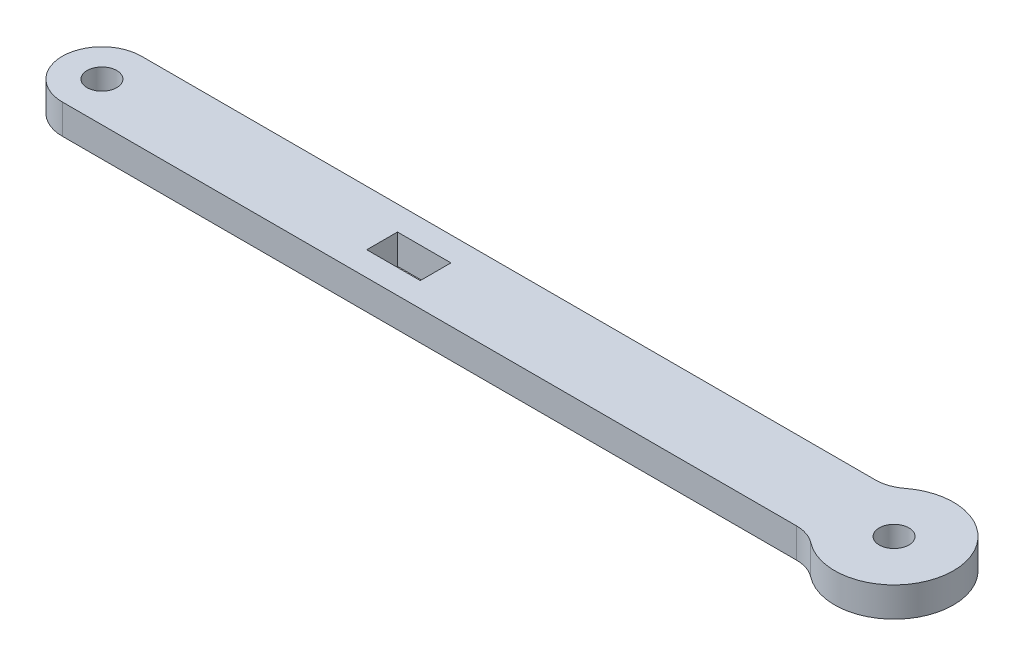
ISO-10303-21;
HEADER;
FILE_DESCRIPTION(('STEP AP214'),'2;1');
FILE_NAME('part.step','',(''),(''),'','','');
FILE_SCHEMA(('AUTOMOTIVE_DESIGN { 1 0 10303 214 1 1 1 1 }'));
ENDSEC;
DATA;
#1=APPLICATION_CONTEXT('core data for automotive mechanical design processes');
#2=APPLICATION_PROTOCOL_DEFINITION('international standard','automotive_design',2000,#1);
#3=PRODUCT_CONTEXT('',#1,'mechanical');
#4=PRODUCT('Part','Part','',(#3));
#5=PRODUCT_RELATED_PRODUCT_CATEGORY('part','',(#4));
#6=PRODUCT_DEFINITION_FORMATION('','',#4);
#7=PRODUCT_DEFINITION_CONTEXT('part definition',#1,'design');
#8=PRODUCT_DEFINITION('design','',#6,#7);
#9=PRODUCT_DEFINITION_SHAPE('','',#8);
#10=(LENGTH_UNIT() NAMED_UNIT(*) SI_UNIT(.MILLI.,.METRE.));
#11=(NAMED_UNIT(*) PLANE_ANGLE_UNIT() SI_UNIT($,.RADIAN.));
#12=(NAMED_UNIT(*) SI_UNIT($,.STERADIAN.) SOLID_ANGLE_UNIT());
#13=UNCERTAINTY_MEASURE_WITH_UNIT(LENGTH_MEASURE(1.E-05),#10,'distance_accuracy_value','');
#14=(GEOMETRIC_REPRESENTATION_CONTEXT(3) GLOBAL_UNCERTAINTY_ASSIGNED_CONTEXT((#13)) GLOBAL_UNIT_ASSIGNED_CONTEXT((#10,
#11,#12)) REPRESENTATION_CONTEXT('',''));
#15=CARTESIAN_POINT('',(0.,0.,0.));
#16=DIRECTION('',(0.,0.,1.));
#17=DIRECTION('',(1.,0.,0.));
#18=AXIS2_PLACEMENT_3D('',#15,#16,#17);
#19=CARTESIAN_POINT('',(0.,-3.,0.));
#20=DIRECTION('',(0.,1.,0.));
#21=DIRECTION('',(0.,0.,1.));
#22=AXIS2_PLACEMENT_3D('',#19,#20,#21);
#23=CYLINDRICAL_SURFACE('',#22,4.);
#24=CARTESIAN_POINT('',(0.,0.,0.));
#25=DIRECTION('',(0.,1.,0.));
#26=DIRECTION('',(0.,0.,-1.));
#27=AXIS2_PLACEMENT_3D('',#24,#25,#26);
#28=CIRCLE('',#27,4.);
#29=CARTESIAN_POINT('',(0.,0.,-4.));
#30=VERTEX_POINT('',#29);
#31=CARTESIAN_POINT('',(0.,0.,4.));
#32=VERTEX_POINT('',#31);
#33=EDGE_CURVE('E147',#30,#32,#28,.T.);
#34=ORIENTED_EDGE('',*,*,#33,.F.);
#35=DIRECTION('',(0.,1.,0.));
#36=VECTOR('',#35,1.);
#37=CARTESIAN_POINT('',(0.,-3.,-4.));
#38=LINE('',#37,#36);
#39=CARTESIAN_POINT('',(0.,-3.,-4.));
#40=VERTEX_POINT('',#39);
#41=EDGE_CURVE('E11',#40,#30,#38,.T.);
#42=ORIENTED_EDGE('',*,*,#41,.F.);
#43=CARTESIAN_POINT('',(0.,-3.,0.));
#44=DIRECTION('',(0.,1.,0.));
#45=DIRECTION('',(0.,0.,-1.));
#46=AXIS2_PLACEMENT_3D('',#43,#44,#45);
#47=CIRCLE('',#46,4.);
#48=CARTESIAN_POINT('',(0.,-3.,4.));
#49=VERTEX_POINT('',#48);
#50=EDGE_CURVE('E151',#40,#49,#47,.T.);
#51=ORIENTED_EDGE('',*,*,#50,.T.);
#52=DIRECTION('',(0.,1.,0.));
#53=VECTOR('',#52,1.);
#54=CARTESIAN_POINT('',(0.,-3.,4.));
#55=LINE('',#54,#53);
#56=EDGE_CURVE('E37',#49,#32,#55,.T.);
#57=ORIENTED_EDGE('',*,*,#56,.T.);
#58=EDGE_LOOP('',(#34,#42,#51,#57));
#59=FACE_BOUND('',#58,.T.);
#60=ADVANCED_FACE('F34',(#59),#23,.T.);
#61=CARTESIAN_POINT('',(0.,-3.,-4.));
#62=DIRECTION('',(0.,0.,-1.));
#63=DIRECTION('',(-1.,0.,0.));
#64=AXIS2_PLACEMENT_3D('',#61,#62,#63);
#65=PLANE('',#64);
#66=DIRECTION('',(-1.,0.,0.));
#67=VECTOR('',#66,1.);
#68=CARTESIAN_POINT('',(0.,0.,-4.));
#69=LINE('',#68,#67);
#70=CARTESIAN_POINT('',(74.1348486805539,0.,-4.));
#71=VERTEX_POINT('',#70);
#72=EDGE_CURVE('E155',#71,#30,#69,.T.);
#73=ORIENTED_EDGE('',*,*,#72,.F.);
#74=DIRECTION('',(0.,1.,0.));
#75=VECTOR('',#74,1.);
#76=CARTESIAN_POINT('',(74.1348486805539,-3.,-4.));
#77=LINE('',#76,#75);
#78=CARTESIAN_POINT('',(74.1348486805539,-3.,-4.));
#79=VERTEX_POINT('',#78);
#80=EDGE_CURVE('E42',#79,#71,#77,.T.);
#81=ORIENTED_EDGE('',*,*,#80,.F.);
#82=DIRECTION('',(-1.,0.,0.));
#83=VECTOR('',#82,1.);
#84=CARTESIAN_POINT('',(0.,-3.,-4.));
#85=LINE('',#84,#83);
#86=EDGE_CURVE('E167',#79,#40,#85,.T.);
#87=ORIENTED_EDGE('',*,*,#86,.T.);
#88=ORIENTED_EDGE('',*,*,#41,.T.);
#89=EDGE_LOOP('',(#73,#81,#87,#88));
#90=FACE_BOUND('',#89,.T.);
#91=ADVANCED_FACE('F204',(#90),#65,.T.);
#92=CARTESIAN_POINT('',(74.1348486805539,-3.,-7.6));
#93=DIRECTION('',(0.,1.,0.));
#94=DIRECTION('',(0.,0.,1.));
#95=AXIS2_PLACEMENT_3D('',#92,#93,#94);
#96=CYLINDRICAL_SURFACE('',#95,3.6);
#97=CARTESIAN_POINT('',(74.1348486805539,0.,-7.6));
#98=DIRECTION('',(0.,-1.,0.));
#99=DIRECTION('',(0.,0.,1.));
#100=AXIS2_PLACEMENT_3D('',#97,#98,#99);
#101=CIRCLE('',#100,3.6);
#102=CARTESIAN_POINT('',(76.3342804253462,0.,-4.75));
#103=VERTEX_POINT('',#102);
#104=EDGE_CURVE('E181',#103,#71,#101,.T.);
#105=ORIENTED_EDGE('',*,*,#104,.F.);
#106=DIRECTION('',(0.,1.,0.));
#107=VECTOR('',#106,1.);
#108=CARTESIAN_POINT('',(76.3342804253462,-3.,-4.75));
#109=LINE('',#108,#107);
#110=CARTESIAN_POINT('',(76.3342804253462,-3.,-4.75));
#111=VERTEX_POINT('',#110);
#112=EDGE_CURVE('E187',#111,#103,#109,.T.);
#113=ORIENTED_EDGE('',*,*,#112,.F.);
#114=CARTESIAN_POINT('',(74.1348486805539,-3.,-7.6));
#115=DIRECTION('',(0.,-1.,0.));
#116=DIRECTION('',(0.,0.,1.));
#117=AXIS2_PLACEMENT_3D('',#114,#115,#116);
#118=CIRCLE('',#117,3.6);
#119=EDGE_CURVE('E164',#111,#79,#118,.T.);
#120=ORIENTED_EDGE('',*,*,#119,.T.);
#121=ORIENTED_EDGE('',*,*,#80,.T.);
#122=EDGE_LOOP('',(#105,#113,#120,#121));
#123=FACE_BOUND('',#122,.T.);
#124=ADVANCED_FACE('F215',(#123),#96,.F.);
#125=CARTESIAN_POINT('',(80.,-3.,0.));
#126=DIRECTION('',(0.,1.,0.));
#127=DIRECTION('',(0.,0.,1.));
#128=AXIS2_PLACEMENT_3D('',#125,#126,#127);
#129=CYLINDRICAL_SURFACE('',#128,6.);
#130=CARTESIAN_POINT('',(80.,0.,0.));
#131=DIRECTION('',(0.,1.,0.));
#132=DIRECTION('',(0.,0.,1.));
#133=AXIS2_PLACEMENT_3D('',#130,#131,#132);
#134=CIRCLE('',#133,6.);
#135=CARTESIAN_POINT('',(76.3342804253462,0.,4.75));
#136=VERTEX_POINT('',#135);
#137=EDGE_CURVE('E178',#136,#103,#134,.T.);
#138=ORIENTED_EDGE('',*,*,#137,.F.);
#139=DIRECTION('',(0.,1.,0.));
#140=VECTOR('',#139,1.);
#141=CARTESIAN_POINT('',(76.3342804253462,-3.,4.75));
#142=LINE('',#141,#140);
#143=CARTESIAN_POINT('',(76.3342804253462,-3.,4.75));
#144=VERTEX_POINT('',#143);
#145=EDGE_CURVE('E189',#144,#136,#142,.T.);
#146=ORIENTED_EDGE('',*,*,#145,.F.);
#147=CARTESIAN_POINT('',(80.,-3.,0.));
#148=DIRECTION('',(0.,1.,0.));
#149=DIRECTION('',(0.,0.,1.));
#150=AXIS2_PLACEMENT_3D('',#147,#148,#149);
#151=CIRCLE('',#150,6.);
#152=EDGE_CURVE('E161',#144,#111,#151,.T.);
#153=ORIENTED_EDGE('',*,*,#152,.T.);
#154=ORIENTED_EDGE('',*,*,#112,.T.);
#155=EDGE_LOOP('',(#138,#146,#153,#154));
#156=FACE_BOUND('',#155,.T.);
#157=ADVANCED_FACE('F213',(#156),#129,.T.);
#158=CARTESIAN_POINT('',(74.1348486805539,-3.,7.6));
#159=DIRECTION('',(0.,1.,0.));
#160=DIRECTION('',(0.,0.,1.));
#161=AXIS2_PLACEMENT_3D('',#158,#159,#160);
#162=CYLINDRICAL_SURFACE('',#161,3.6);
#163=CARTESIAN_POINT('',(74.1348486805539,0.,7.6));
#164=DIRECTION('',(0.,-1.,0.));
#165=DIRECTION('',(0.,0.,-1.));
#166=AXIS2_PLACEMENT_3D('',#163,#164,#165);
#167=CIRCLE('',#166,3.6);
#168=CARTESIAN_POINT('',(74.1348486805539,0.,4.));
#169=VERTEX_POINT('',#168);
#170=EDGE_CURVE('E175',#169,#136,#167,.T.);
#171=ORIENTED_EDGE('',*,*,#170,.F.);
#172=DIRECTION('',(0.,1.,0.));
#173=VECTOR('',#172,1.);
#174=CARTESIAN_POINT('',(74.1348486805539,-3.,4.));
#175=LINE('',#174,#173);
#176=CARTESIAN_POINT('',(74.1348486805539,-3.,4.));
#177=VERTEX_POINT('',#176);
#178=EDGE_CURVE('E190',#177,#169,#175,.T.);
#179=ORIENTED_EDGE('',*,*,#178,.F.);
#180=CARTESIAN_POINT('',(74.1348486805539,-3.,7.6));
#181=DIRECTION('',(0.,-1.,0.));
#182=DIRECTION('',(0.,0.,-1.));
#183=AXIS2_PLACEMENT_3D('',#180,#181,#182);
#184=CIRCLE('',#183,3.6);
#185=EDGE_CURVE('E158',#177,#144,#184,.T.);
#186=ORIENTED_EDGE('',*,*,#185,.T.);
#187=ORIENTED_EDGE('',*,*,#145,.T.);
#188=EDGE_LOOP('',(#171,#179,#186,#187));
#189=FACE_BOUND('',#188,.T.);
#190=ADVANCED_FACE('F210',(#189),#162,.F.);
#191=CARTESIAN_POINT('',(0.,-3.,4.));
#192=DIRECTION('',(0.,0.,1.));
#193=DIRECTION('',(1.,0.,0.));
#194=AXIS2_PLACEMENT_3D('',#191,#192,#193);
#195=PLANE('',#194);
#196=DIRECTION('',(1.,0.,0.));
#197=VECTOR('',#196,1.);
#198=CARTESIAN_POINT('',(0.,0.,4.));
#199=LINE('',#198,#197);
#200=EDGE_CURVE('E172',#32,#169,#199,.T.);
#201=ORIENTED_EDGE('',*,*,#200,.F.);
#202=ORIENTED_EDGE('',*,*,#56,.F.);
#203=DIRECTION('',(1.,0.,0.));
#204=VECTOR('',#203,1.);
#205=CARTESIAN_POINT('',(0.,-3.,4.));
#206=LINE('',#205,#204);
#207=EDGE_CURVE('E154',#49,#177,#206,.T.);
#208=ORIENTED_EDGE('',*,*,#207,.T.);
#209=ORIENTED_EDGE('',*,*,#178,.T.);
#210=EDGE_LOOP('',(#201,#202,#208,#209));
#211=FACE_BOUND('',#210,.T.);
#212=ADVANCED_FACE('F198',(#211),#195,.T.);
#213=CARTESIAN_POINT('',(0.,-3.,0.));
#214=DIRECTION('',(0.,-1.,0.));
#215=DIRECTION('',(0.,0.,-1.));
#216=AXIS2_PLACEMENT_3D('',#213,#214,#215);
#217=PLANE('',#216);
#218=CARTESIAN_POINT('',(0.,-3.,0.));
#219=DIRECTION('',(0.,1.,0.));
#220=DIRECTION('',(0.,0.,1.));
#221=AXIS2_PLACEMENT_3D('',#218,#219,#220);
#222=CIRCLE('',#221,1.5);
#223=CARTESIAN_POINT('',(0.,-3.,1.5));
#224=VERTEX_POINT('',#223);
#225=EDGE_CURVE('E336',#224,#224,#222,.T.);
#226=ORIENTED_EDGE('',*,*,#225,.T.);
#227=EDGE_LOOP('',(#226));
#228=FACE_BOUND('',#227,.T.);
#229=CARTESIAN_POINT('',(80.,-3.,0.));
#230=DIRECTION('',(0.,1.,0.));
#231=DIRECTION('',(0.,0.,1.));
#232=AXIS2_PLACEMENT_3D('',#229,#230,#231);
#233=CIRCLE('',#232,1.5);
#234=CARTESIAN_POINT('',(80.,-3.,1.5));
#235=VERTEX_POINT('',#234);
#236=EDGE_CURVE('E135',#235,#235,#233,.T.);
#237=ORIENTED_EDGE('',*,*,#236,.T.);
#238=EDGE_LOOP('',(#237));
#239=FACE_BOUND('',#238,.T.);
#240=DIRECTION('',(0.,0.,1.));
#241=VECTOR('',#240,1.);
#242=CARTESIAN_POINT('',(28.3,-3.,-1.55));
#243=LINE('',#242,#241);
#244=CARTESIAN_POINT('',(28.3,-3.,-1.55));
#245=VERTEX_POINT('',#244);
#246=CARTESIAN_POINT('',(28.3,-3.,1.55));
#247=VERTEX_POINT('',#246);
#248=EDGE_CURVE('E113',#245,#247,#243,.T.);
#249=ORIENTED_EDGE('',*,*,#248,.T.);
#250=DIRECTION('',(1.,0.,0.));
#251=VECTOR('',#250,1.);
#252=CARTESIAN_POINT('',(33.7,-3.,1.55));
#253=LINE('',#252,#251);
#254=CARTESIAN_POINT('',(33.7,-3.,1.55));
#255=VERTEX_POINT('',#254);
#256=EDGE_CURVE('E122',#247,#255,#253,.T.);
#257=ORIENTED_EDGE('',*,*,#256,.T.);
#258=DIRECTION('',(0.,0.,-1.));
#259=VECTOR('',#258,1.);
#260=CARTESIAN_POINT('',(33.7,-3.,-1.55));
#261=LINE('',#260,#259);
#262=CARTESIAN_POINT('',(33.7,-3.,-1.55));
#263=VERTEX_POINT('',#262);
#264=EDGE_CURVE('E50',#255,#263,#261,.T.);
#265=ORIENTED_EDGE('',*,*,#264,.T.);
#266=DIRECTION('',(-1.,0.,0.));
#267=VECTOR('',#266,1.);
#268=CARTESIAN_POINT('',(33.7,-3.,-1.55));
#269=LINE('',#268,#267);
#270=EDGE_CURVE('E119',#263,#245,#269,.T.);
#271=ORIENTED_EDGE('',*,*,#270,.T.);
#272=EDGE_LOOP('',(#249,#257,#265,#271));
#273=FACE_BOUND('',#272,.T.);
#274=ORIENTED_EDGE('',*,*,#50,.F.);
#275=ORIENTED_EDGE('',*,*,#86,.F.);
#276=ORIENTED_EDGE('',*,*,#119,.F.);
#277=ORIENTED_EDGE('',*,*,#152,.F.);
#278=ORIENTED_EDGE('',*,*,#185,.F.);
#279=ORIENTED_EDGE('',*,*,#207,.F.);
#280=EDGE_LOOP('',(#274,#275,#276,#277,#278,#279));
#281=FACE_BOUND('',#280,.T.);
#282=ADVANCED_FACE('F126',(#228,#239,#273,#281),#217,.T.);
#283=CARTESIAN_POINT('',(0.,0.,0.));
#284=DIRECTION('',(0.,-1.,0.));
#285=DIRECTION('',(0.,0.,-1.));
#286=AXIS2_PLACEMENT_3D('',#283,#284,#285);
#287=PLANE('',#286);
#288=CARTESIAN_POINT('',(0.,0.,0.));
#289=DIRECTION('',(0.,1.,0.));
#290=DIRECTION('',(0.,0.,1.));
#291=AXIS2_PLACEMENT_3D('',#288,#289,#290);
#292=CIRCLE('',#291,1.5);
#293=CARTESIAN_POINT('',(0.,0.,1.5));
#294=VERTEX_POINT('',#293);
#295=EDGE_CURVE('E339',#294,#294,#292,.T.);
#296=ORIENTED_EDGE('',*,*,#295,.F.);
#297=EDGE_LOOP('',(#296));
#298=FACE_BOUND('',#297,.T.);
#299=CARTESIAN_POINT('',(80.,0.,0.));
#300=DIRECTION('',(0.,1.,0.));
#301=DIRECTION('',(0.,0.,1.));
#302=AXIS2_PLACEMENT_3D('',#299,#300,#301);
#303=CIRCLE('',#302,1.5);
#304=CARTESIAN_POINT('',(80.,0.,1.5));
#305=VERTEX_POINT('',#304);
#306=EDGE_CURVE('E341',#305,#305,#303,.T.);
#307=ORIENTED_EDGE('',*,*,#306,.F.);
#308=EDGE_LOOP('',(#307));
#309=FACE_BOUND('',#308,.T.);
#310=DIRECTION('',(1.,0.,0.));
#311=VECTOR('',#310,1.);
#312=CARTESIAN_POINT('',(33.7,0.,1.55));
#313=LINE('',#312,#311);
#314=CARTESIAN_POINT('',(28.3,0.,1.55));
#315=VERTEX_POINT('',#314);
#316=CARTESIAN_POINT('',(33.7,0.,1.55));
#317=VERTEX_POINT('',#316);
#318=EDGE_CURVE('E141',#315,#317,#313,.T.);
#319=ORIENTED_EDGE('',*,*,#318,.F.);
#320=DIRECTION('',(0.,0.,1.));
#321=VECTOR('',#320,1.);
#322=CARTESIAN_POINT('',(28.3,0.,-1.55));
#323=LINE('',#322,#321);
#324=CARTESIAN_POINT('',(28.3,0.,-1.55));
#325=VERTEX_POINT('',#324);
#326=EDGE_CURVE('E58',#325,#315,#323,.T.);
#327=ORIENTED_EDGE('',*,*,#326,.F.);
#328=DIRECTION('',(-1.,0.,0.));
#329=VECTOR('',#328,1.);
#330=CARTESIAN_POINT('',(33.7,0.,-1.55));
#331=LINE('',#330,#329);
#332=CARTESIAN_POINT('',(33.7,0.,-1.55));
#333=VERTEX_POINT('',#332);
#334=EDGE_CURVE('E129',#333,#325,#331,.T.);
#335=ORIENTED_EDGE('',*,*,#334,.F.);
#336=DIRECTION('',(0.,0.,-1.));
#337=VECTOR('',#336,1.);
#338=CARTESIAN_POINT('',(33.7,0.,-1.55));
#339=LINE('',#338,#337);
#340=EDGE_CURVE('E132',#317,#333,#339,.T.);
#341=ORIENTED_EDGE('',*,*,#340,.F.);
#342=EDGE_LOOP('',(#319,#327,#335,#341));
#343=FACE_BOUND('',#342,.T.);
#344=ORIENTED_EDGE('',*,*,#33,.T.);
#345=ORIENTED_EDGE('',*,*,#200,.T.);
#346=ORIENTED_EDGE('',*,*,#170,.T.);
#347=ORIENTED_EDGE('',*,*,#137,.T.);
#348=ORIENTED_EDGE('',*,*,#104,.T.);
#349=ORIENTED_EDGE('',*,*,#72,.T.);
#350=EDGE_LOOP('',(#344,#345,#346,#347,#348,#349));
#351=FACE_BOUND('',#350,.T.);
#352=ADVANCED_FACE('F200',(#298,#309,#343,#351),#287,.F.);
#353=CARTESIAN_POINT('',(28.3,-3.,-1.55));
#354=DIRECTION('',(-1.,0.,0.));
#355=DIRECTION('',(0.,0.,1.));
#356=AXIS2_PLACEMENT_3D('',#353,#354,#355);
#357=PLANE('',#356);
#358=ORIENTED_EDGE('',*,*,#326,.T.);
#359=DIRECTION('',(0.,1.,0.));
#360=VECTOR('',#359,1.);
#361=CARTESIAN_POINT('',(28.3,-3.,1.55));
#362=LINE('',#361,#360);
#363=EDGE_CURVE('E109',#247,#315,#362,.T.);
#364=ORIENTED_EDGE('',*,*,#363,.F.);
#365=ORIENTED_EDGE('',*,*,#248,.F.);
#366=DIRECTION('',(0.,1.,0.));
#367=VECTOR('',#366,1.);
#368=CARTESIAN_POINT('',(28.3,-3.,-1.55));
#369=LINE('',#368,#367);
#370=EDGE_CURVE('E145',#245,#325,#369,.T.);
#371=ORIENTED_EDGE('',*,*,#370,.T.);
#372=EDGE_LOOP('',(#358,#364,#365,#371));
#373=FACE_BOUND('',#372,.T.);
#374=ADVANCED_FACE('F111',(#373),#357,.F.);
#375=CARTESIAN_POINT('',(33.7,-3.,-1.55));
#376=DIRECTION('',(0.,0.,-1.));
#377=DIRECTION('',(-1.,0.,0.));
#378=AXIS2_PLACEMENT_3D('',#375,#376,#377);
#379=PLANE('',#378);
#380=ORIENTED_EDGE('',*,*,#334,.T.);
#381=ORIENTED_EDGE('',*,*,#370,.F.);
#382=ORIENTED_EDGE('',*,*,#270,.F.);
#383=DIRECTION('',(0.,1.,0.));
#384=VECTOR('',#383,1.);
#385=CARTESIAN_POINT('',(33.7,-3.,-1.55));
#386=LINE('',#385,#384);
#387=EDGE_CURVE('E148',#263,#333,#386,.T.);
#388=ORIENTED_EDGE('',*,*,#387,.T.);
#389=EDGE_LOOP('',(#380,#381,#382,#388));
#390=FACE_BOUND('',#389,.T.);
#391=ADVANCED_FACE('F267',(#390),#379,.F.);
#392=CARTESIAN_POINT('',(33.7,-3.,-1.55));
#393=DIRECTION('',(1.,0.,0.));
#394=DIRECTION('',(0.,0.,-1.));
#395=AXIS2_PLACEMENT_3D('',#392,#393,#394);
#396=PLANE('',#395);
#397=ORIENTED_EDGE('',*,*,#340,.T.);
#398=ORIENTED_EDGE('',*,*,#387,.F.);
#399=ORIENTED_EDGE('',*,*,#264,.F.);
#400=DIRECTION('',(0.,1.,0.));
#401=VECTOR('',#400,1.);
#402=CARTESIAN_POINT('',(33.7,-3.,1.55));
#403=LINE('',#402,#401);
#404=EDGE_CURVE('E118',#255,#317,#403,.T.);
#405=ORIENTED_EDGE('',*,*,#404,.T.);
#406=EDGE_LOOP('',(#397,#398,#399,#405));
#407=FACE_BOUND('',#406,.T.);
#408=ADVANCED_FACE('F278',(#407),#396,.F.);
#409=CARTESIAN_POINT('',(33.7,-3.,1.55));
#410=DIRECTION('',(0.,0.,1.));
#411=DIRECTION('',(1.,0.,0.));
#412=AXIS2_PLACEMENT_3D('',#409,#410,#411);
#413=PLANE('',#412);
#414=ORIENTED_EDGE('',*,*,#318,.T.);
#415=ORIENTED_EDGE('',*,*,#404,.F.);
#416=ORIENTED_EDGE('',*,*,#256,.F.);
#417=ORIENTED_EDGE('',*,*,#363,.T.);
#418=EDGE_LOOP('',(#414,#415,#416,#417));
#419=FACE_BOUND('',#418,.T.);
#420=ADVANCED_FACE('F123',(#419),#413,.F.);
#421=CARTESIAN_POINT('',(80.,0.,0.));
#422=DIRECTION('',(0.,1.,0.));
#423=DIRECTION('',(0.,0.,1.));
#424=AXIS2_PLACEMENT_3D('',#421,#422,#423);
#425=CYLINDRICAL_SURFACE('',#424,1.5);
#426=ORIENTED_EDGE('',*,*,#236,.F.);
#427=EDGE_LOOP('',(#426));
#428=FACE_BOUND('',#427,.T.);
#429=ORIENTED_EDGE('',*,*,#306,.T.);
#430=EDGE_LOOP('',(#429));
#431=FACE_BOUND('',#430,.T.);
#432=ADVANCED_FACE('F296',(#428,#431),#425,.F.);
#433=CARTESIAN_POINT('',(0.,0.,0.));
#434=DIRECTION('',(0.,1.,0.));
#435=DIRECTION('',(0.,0.,1.));
#436=AXIS2_PLACEMENT_3D('',#433,#434,#435);
#437=CYLINDRICAL_SURFACE('',#436,1.5);
#438=ORIENTED_EDGE('',*,*,#225,.F.);
#439=EDGE_LOOP('',(#438));
#440=FACE_BOUND('',#439,.T.);
#441=ORIENTED_EDGE('',*,*,#295,.T.);
#442=EDGE_LOOP('',(#441));
#443=FACE_BOUND('',#442,.T.);
#444=ADVANCED_FACE('F319',(#440,#443),#437,.F.);
#445=CLOSED_SHELL('',(#60,#91,#124,#157,#190,#212,#282,#352,#374,#391,#408,#420,#432,#444));
#446=MANIFOLD_SOLID_BREP('B2',#445);
#447=ADVANCED_BREP_SHAPE_REPRESENTATION('',(#18,#446),#14);
#448=SHAPE_DEFINITION_REPRESENTATION(#9,#447);
ENDSEC;
END-ISO-10303-21;
